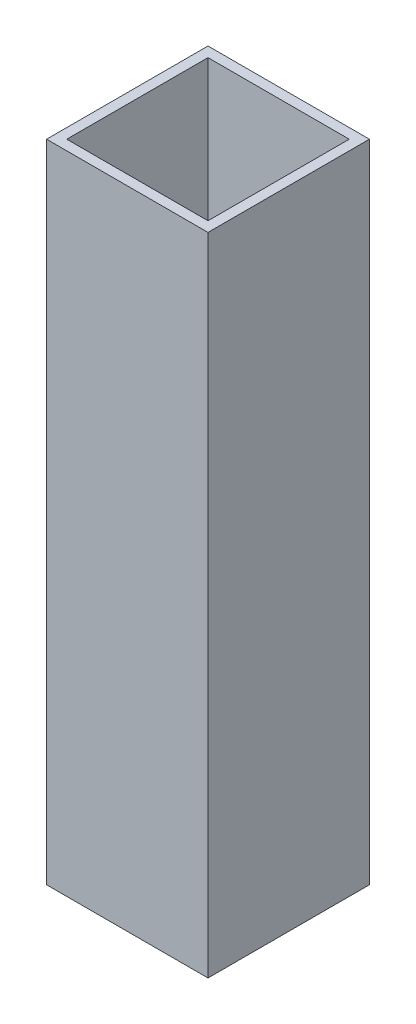
ISO-10303-21;
HEADER;
FILE_DESCRIPTION(('STEP AP214'),'2;1');
FILE_NAME('part.step','',(''),(''),'','','');
FILE_SCHEMA(('AUTOMOTIVE_DESIGN { 1 0 10303 214 1 1 1 1 }'));
ENDSEC;
DATA;
#1=APPLICATION_CONTEXT('core data for automotive mechanical design processes');
#2=APPLICATION_PROTOCOL_DEFINITION('international standard','automotive_design',2000,#1);
#3=PRODUCT_CONTEXT('',#1,'mechanical');
#4=PRODUCT('Part','Part','',(#3));
#5=PRODUCT_RELATED_PRODUCT_CATEGORY('part','',(#4));
#6=PRODUCT_DEFINITION_FORMATION('','',#4);
#7=PRODUCT_DEFINITION_CONTEXT('part definition',#1,'design');
#8=PRODUCT_DEFINITION('design','',#6,#7);
#9=PRODUCT_DEFINITION_SHAPE('','',#8);
#10=(LENGTH_UNIT() NAMED_UNIT(*) SI_UNIT(.MILLI.,.METRE.));
#11=(NAMED_UNIT(*) PLANE_ANGLE_UNIT() SI_UNIT($,.RADIAN.));
#12=(NAMED_UNIT(*) SI_UNIT($,.STERADIAN.) SOLID_ANGLE_UNIT());
#13=UNCERTAINTY_MEASURE_WITH_UNIT(LENGTH_MEASURE(1.E-05),#10,'distance_accuracy_value','');
#14=(GEOMETRIC_REPRESENTATION_CONTEXT(3) GLOBAL_UNCERTAINTY_ASSIGNED_CONTEXT((#13)) GLOBAL_UNIT_ASSIGNED_CONTEXT((#10,
#11,#12)) REPRESENTATION_CONTEXT('',''));
#15=CARTESIAN_POINT('',(0.,0.,0.));
#16=DIRECTION('',(0.,0.,1.));
#17=DIRECTION('',(1.,0.,0.));
#18=AXIS2_PLACEMENT_3D('',#15,#16,#17);
#19=CARTESIAN_POINT('',(0.,101.6,0.));
#20=DIRECTION('',(0.,-1.,0.));
#21=DIRECTION('',(0.,0.,-1.));
#22=AXIS2_PLACEMENT_3D('',#19,#20,#21);
#23=PLANE('',#22);
#24=DIRECTION('',(0.,0.,-1.));
#25=VECTOR('',#24,1.);
#26=CARTESIAN_POINT('',(12.7,101.6,12.7));
#27=LINE('',#26,#25);
#28=CARTESIAN_POINT('',(12.7,101.6,12.7));
#29=VERTEX_POINT('',#28);
#30=CARTESIAN_POINT('',(12.7,101.6,-12.7));
#31=VERTEX_POINT('',#30);
#32=EDGE_CURVE('E136',#29,#31,#27,.T.);
#33=ORIENTED_EDGE('',*,*,#32,.T.);
#34=DIRECTION('',(-1.,0.,0.));
#35=VECTOR('',#34,1.);
#36=CARTESIAN_POINT('',(-12.7,101.6,-12.7));
#37=LINE('',#36,#35);
#38=CARTESIAN_POINT('',(-12.7,101.6,-12.7));
#39=VERTEX_POINT('',#38);
#40=EDGE_CURVE('E139',#31,#39,#37,.T.);
#41=ORIENTED_EDGE('',*,*,#40,.T.);
#42=DIRECTION('',(0.,0.,1.));
#43=VECTOR('',#42,1.);
#44=CARTESIAN_POINT('',(-12.7,101.6,12.7));
#45=LINE('',#44,#43);
#46=CARTESIAN_POINT('',(-12.7,101.6,12.7));
#47=VERTEX_POINT('',#46);
#48=EDGE_CURVE('E142',#39,#47,#45,.T.);
#49=ORIENTED_EDGE('',*,*,#48,.T.);
#50=DIRECTION('',(1.,0.,0.));
#51=VECTOR('',#50,1.);
#52=CARTESIAN_POINT('',(-12.7,101.6,12.7));
#53=LINE('',#52,#51);
#54=EDGE_CURVE('E144',#47,#29,#53,.T.);
#55=ORIENTED_EDGE('',*,*,#54,.T.);
#56=EDGE_LOOP('',(#33,#41,#49,#55));
#57=FACE_BOUND('',#56,.T.);
#58=DIRECTION('',(0.,0.,-1.));
#59=VECTOR('',#58,1.);
#60=CARTESIAN_POINT('',(11.1125,101.6,11.1125));
#61=LINE('',#60,#59);
#62=CARTESIAN_POINT('',(11.1125,101.6,11.1125));
#63=VERTEX_POINT('',#62);
#64=CARTESIAN_POINT('',(11.1125,101.6,-11.1125));
#65=VERTEX_POINT('',#64);
#66=EDGE_CURVE('E100',#63,#65,#61,.T.);
#67=ORIENTED_EDGE('',*,*,#66,.F.);
#68=DIRECTION('',(1.,0.,0.));
#69=VECTOR('',#68,1.);
#70=CARTESIAN_POINT('',(-11.1125,101.6,11.1125));
#71=LINE('',#70,#69);
#72=CARTESIAN_POINT('',(-11.1125,101.6,11.1125));
#73=VERTEX_POINT('',#72);
#74=EDGE_CURVE('E122',#73,#63,#71,.T.);
#75=ORIENTED_EDGE('',*,*,#74,.F.);
#76=DIRECTION('',(0.,0.,1.));
#77=VECTOR('',#76,1.);
#78=CARTESIAN_POINT('',(-11.1125,101.6,11.1125));
#79=LINE('',#78,#77);
#80=CARTESIAN_POINT('',(-11.1125,101.6,-11.1125));
#81=VERTEX_POINT('',#80);
#82=EDGE_CURVE('E120',#81,#73,#79,.T.);
#83=ORIENTED_EDGE('',*,*,#82,.F.);
#84=DIRECTION('',(-1.,0.,0.));
#85=VECTOR('',#84,1.);
#86=CARTESIAN_POINT('',(-11.1125,101.6,-11.1125));
#87=LINE('',#86,#85);
#88=EDGE_CURVE('E108',#65,#81,#87,.T.);
#89=ORIENTED_EDGE('',*,*,#88,.F.);
#90=EDGE_LOOP('',(#67,#75,#83,#89));
#91=FACE_BOUND('',#90,.T.);
#92=ADVANCED_FACE('F35',(#57,#91),#23,.F.);
#93=CARTESIAN_POINT('',(0.,0.,0.));
#94=DIRECTION('',(0.,-1.,0.));
#95=DIRECTION('',(0.,0.,-1.));
#96=AXIS2_PLACEMENT_3D('',#93,#94,#95);
#97=PLANE('',#96);
#98=DIRECTION('',(0.,0.,-1.));
#99=VECTOR('',#98,1.);
#100=CARTESIAN_POINT('',(12.7,0.,12.7));
#101=LINE('',#100,#99);
#102=CARTESIAN_POINT('',(12.7,0.,12.7));
#103=VERTEX_POINT('',#102);
#104=CARTESIAN_POINT('',(12.7,0.,-12.7));
#105=VERTEX_POINT('',#104);
#106=EDGE_CURVE('E116',#103,#105,#101,.T.);
#107=ORIENTED_EDGE('',*,*,#106,.F.);
#108=DIRECTION('',(1.,0.,0.));
#109=VECTOR('',#108,1.);
#110=CARTESIAN_POINT('',(-12.7,0.,12.7));
#111=LINE('',#110,#109);
#112=CARTESIAN_POINT('',(-12.7,0.,12.7));
#113=VERTEX_POINT('',#112);
#114=EDGE_CURVE('E140',#113,#103,#111,.T.);
#115=ORIENTED_EDGE('',*,*,#114,.F.);
#116=DIRECTION('',(0.,0.,1.));
#117=VECTOR('',#116,1.);
#118=CARTESIAN_POINT('',(-12.7,0.,12.7));
#119=LINE('',#118,#117);
#120=CARTESIAN_POINT('',(-12.7,0.,-12.7));
#121=VERTEX_POINT('',#120);
#122=EDGE_CURVE('E151',#121,#113,#119,.T.);
#123=ORIENTED_EDGE('',*,*,#122,.F.);
#124=DIRECTION('',(-1.,0.,0.));
#125=VECTOR('',#124,1.);
#126=CARTESIAN_POINT('',(-12.7,0.,-12.7));
#127=LINE('',#126,#125);
#128=EDGE_CURVE('E149',#105,#121,#127,.T.);
#129=ORIENTED_EDGE('',*,*,#128,.F.);
#130=EDGE_LOOP('',(#107,#115,#123,#129));
#131=FACE_BOUND('',#130,.T.);
#132=DIRECTION('',(1.,0.,0.));
#133=VECTOR('',#132,1.);
#134=CARTESIAN_POINT('',(-11.1125,0.,11.1125));
#135=LINE('',#134,#133);
#136=CARTESIAN_POINT('',(-11.1125,0.,11.1125));
#137=VERTEX_POINT('',#136);
#138=CARTESIAN_POINT('',(11.1125,0.,11.1125));
#139=VERTEX_POINT('',#138);
#140=EDGE_CURVE('E109',#137,#139,#135,.T.);
#141=ORIENTED_EDGE('',*,*,#140,.T.);
#142=DIRECTION('',(0.,0.,-1.));
#143=VECTOR('',#142,1.);
#144=CARTESIAN_POINT('',(11.1125,0.,11.1125));
#145=LINE('',#144,#143);
#146=CARTESIAN_POINT('',(11.1125,0.,-11.1125));
#147=VERTEX_POINT('',#146);
#148=EDGE_CURVE('E58',#139,#147,#145,.T.);
#149=ORIENTED_EDGE('',*,*,#148,.T.);
#150=DIRECTION('',(-1.,0.,0.));
#151=VECTOR('',#150,1.);
#152=CARTESIAN_POINT('',(-11.1125,0.,-11.1125));
#153=LINE('',#152,#151);
#154=CARTESIAN_POINT('',(-11.1125,0.,-11.1125));
#155=VERTEX_POINT('',#154);
#156=EDGE_CURVE('E115',#147,#155,#153,.T.);
#157=ORIENTED_EDGE('',*,*,#156,.T.);
#158=DIRECTION('',(0.,0.,1.));
#159=VECTOR('',#158,1.);
#160=CARTESIAN_POINT('',(-11.1125,0.,11.1125));
#161=LINE('',#160,#159);
#162=EDGE_CURVE('E128',#155,#137,#161,.T.);
#163=ORIENTED_EDGE('',*,*,#162,.T.);
#164=EDGE_LOOP('',(#141,#149,#157,#163));
#165=FACE_BOUND('',#164,.T.);
#166=ADVANCED_FACE('F169',(#131,#165),#97,.T.);
#167=CARTESIAN_POINT('',(12.7,101.6,12.7));
#168=DIRECTION('',(-1.,0.,0.));
#169=DIRECTION('',(0.,0.,1.));
#170=AXIS2_PLACEMENT_3D('',#167,#168,#169);
#171=PLANE('',#170);
#172=ORIENTED_EDGE('',*,*,#106,.T.);
#173=DIRECTION('',(0.,-1.,0.));
#174=VECTOR('',#173,1.);
#175=CARTESIAN_POINT('',(12.7,101.6,-12.7));
#176=LINE('',#175,#174);
#177=EDGE_CURVE('E11',#31,#105,#176,.T.);
#178=ORIENTED_EDGE('',*,*,#177,.F.);
#179=ORIENTED_EDGE('',*,*,#32,.F.);
#180=DIRECTION('',(0.,-1.,0.));
#181=VECTOR('',#180,1.);
#182=CARTESIAN_POINT('',(12.7,101.6,12.7));
#183=LINE('',#182,#181);
#184=EDGE_CURVE('E146',#29,#103,#183,.T.);
#185=ORIENTED_EDGE('',*,*,#184,.T.);
#186=EDGE_LOOP('',(#172,#178,#179,#185));
#187=FACE_BOUND('',#186,.T.);
#188=ADVANCED_FACE('F37',(#187),#171,.F.);
#189=CARTESIAN_POINT('',(-12.7,101.6,-12.7));
#190=DIRECTION('',(0.,0.,1.));
#191=DIRECTION('',(1.,0.,0.));
#192=AXIS2_PLACEMENT_3D('',#189,#190,#191);
#193=PLANE('',#192);
#194=ORIENTED_EDGE('',*,*,#128,.T.);
#195=DIRECTION('',(0.,-1.,0.));
#196=VECTOR('',#195,1.);
#197=CARTESIAN_POINT('',(-12.7,101.6,-12.7));
#198=LINE('',#197,#196);
#199=EDGE_CURVE('E43',#39,#121,#198,.T.);
#200=ORIENTED_EDGE('',*,*,#199,.F.);
#201=ORIENTED_EDGE('',*,*,#40,.F.);
#202=ORIENTED_EDGE('',*,*,#177,.T.);
#203=EDGE_LOOP('',(#194,#200,#201,#202));
#204=FACE_BOUND('',#203,.T.);
#205=ADVANCED_FACE('F179',(#204),#193,.F.);
#206=CARTESIAN_POINT('',(-12.7,101.6,12.7));
#207=DIRECTION('',(1.,0.,0.));
#208=DIRECTION('',(0.,0.,-1.));
#209=AXIS2_PLACEMENT_3D('',#206,#207,#208);
#210=PLANE('',#209);
#211=ORIENTED_EDGE('',*,*,#122,.T.);
#212=DIRECTION('',(0.,-1.,0.));
#213=VECTOR('',#212,1.);
#214=CARTESIAN_POINT('',(-12.7,101.6,12.7));
#215=LINE('',#214,#213);
#216=EDGE_CURVE('E156',#47,#113,#215,.T.);
#217=ORIENTED_EDGE('',*,*,#216,.F.);
#218=ORIENTED_EDGE('',*,*,#48,.F.);
#219=ORIENTED_EDGE('',*,*,#199,.T.);
#220=EDGE_LOOP('',(#211,#217,#218,#219));
#221=FACE_BOUND('',#220,.T.);
#222=ADVANCED_FACE('F163',(#221),#210,.F.);
#223=CARTESIAN_POINT('',(-12.7,101.6,12.7));
#224=DIRECTION('',(0.,0.,-1.));
#225=DIRECTION('',(-1.,0.,0.));
#226=AXIS2_PLACEMENT_3D('',#223,#224,#225);
#227=PLANE('',#226);
#228=ORIENTED_EDGE('',*,*,#114,.T.);
#229=ORIENTED_EDGE('',*,*,#184,.F.);
#230=ORIENTED_EDGE('',*,*,#54,.F.);
#231=ORIENTED_EDGE('',*,*,#216,.T.);
#232=EDGE_LOOP('',(#228,#229,#230,#231));
#233=FACE_BOUND('',#232,.T.);
#234=ADVANCED_FACE('F173',(#233),#227,.F.);
#235=CARTESIAN_POINT('',(11.1125,101.6,11.1125));
#236=DIRECTION('',(-1.,0.,0.));
#237=DIRECTION('',(0.,0.,1.));
#238=AXIS2_PLACEMENT_3D('',#235,#236,#237);
#239=PLANE('',#238);
#240=ORIENTED_EDGE('',*,*,#148,.F.);
#241=DIRECTION('',(0.,-1.,0.));
#242=VECTOR('',#241,1.);
#243=CARTESIAN_POINT('',(11.1125,101.6,11.1125));
#244=LINE('',#243,#242);
#245=EDGE_CURVE('E104',#63,#139,#244,.T.);
#246=ORIENTED_EDGE('',*,*,#245,.F.);
#247=ORIENTED_EDGE('',*,*,#66,.T.);
#248=DIRECTION('',(0.,-1.,0.));
#249=VECTOR('',#248,1.);
#250=CARTESIAN_POINT('',(11.1125,101.6,-11.1125));
#251=LINE('',#250,#249);
#252=EDGE_CURVE('E103',#65,#147,#251,.T.);
#253=ORIENTED_EDGE('',*,*,#252,.T.);
#254=EDGE_LOOP('',(#240,#246,#247,#253));
#255=FACE_BOUND('',#254,.T.);
#256=ADVANCED_FACE('F102',(#255),#239,.T.);
#257=CARTESIAN_POINT('',(-11.1125,101.6,-11.1125));
#258=DIRECTION('',(0.,0.,1.));
#259=DIRECTION('',(1.,0.,0.));
#260=AXIS2_PLACEMENT_3D('',#257,#258,#259);
#261=PLANE('',#260);
#262=ORIENTED_EDGE('',*,*,#156,.F.);
#263=ORIENTED_EDGE('',*,*,#252,.F.);
#264=ORIENTED_EDGE('',*,*,#88,.T.);
#265=DIRECTION('',(0.,-1.,0.));
#266=VECTOR('',#265,1.);
#267=CARTESIAN_POINT('',(-11.1125,101.6,-11.1125));
#268=LINE('',#267,#266);
#269=EDGE_CURVE('E117',#81,#155,#268,.T.);
#270=ORIENTED_EDGE('',*,*,#269,.T.);
#271=EDGE_LOOP('',(#262,#263,#264,#270));
#272=FACE_BOUND('',#271,.T.);
#273=ADVANCED_FACE('F112',(#272),#261,.T.);
#274=CARTESIAN_POINT('',(-11.1125,101.6,11.1125));
#275=DIRECTION('',(1.,0.,0.));
#276=DIRECTION('',(0.,0.,-1.));
#277=AXIS2_PLACEMENT_3D('',#274,#275,#276);
#278=PLANE('',#277);
#279=ORIENTED_EDGE('',*,*,#162,.F.);
#280=ORIENTED_EDGE('',*,*,#269,.F.);
#281=ORIENTED_EDGE('',*,*,#82,.T.);
#282=DIRECTION('',(0.,-1.,0.));
#283=VECTOR('',#282,1.);
#284=CARTESIAN_POINT('',(-11.1125,101.6,11.1125));
#285=LINE('',#284,#283);
#286=EDGE_CURVE('E50',#73,#137,#285,.T.);
#287=ORIENTED_EDGE('',*,*,#286,.T.);
#288=EDGE_LOOP('',(#279,#280,#281,#287));
#289=FACE_BOUND('',#288,.T.);
#290=ADVANCED_FACE('F202',(#289),#278,.T.);
#291=CARTESIAN_POINT('',(-11.1125,101.6,11.1125));
#292=DIRECTION('',(0.,0.,-1.));
#293=DIRECTION('',(-1.,0.,0.));
#294=AXIS2_PLACEMENT_3D('',#291,#292,#293);
#295=PLANE('',#294);
#296=ORIENTED_EDGE('',*,*,#140,.F.);
#297=ORIENTED_EDGE('',*,*,#286,.F.);
#298=ORIENTED_EDGE('',*,*,#74,.T.);
#299=ORIENTED_EDGE('',*,*,#245,.T.);
#300=EDGE_LOOP('',(#296,#297,#298,#299));
#301=FACE_BOUND('',#300,.T.);
#302=ADVANCED_FACE('F206',(#301),#295,.T.);
#303=CLOSED_SHELL('',(#92,#166,#188,#205,#222,#234,#256,#273,#290,#302));
#304=MANIFOLD_SOLID_BREP('B2',#303);
#305=ADVANCED_BREP_SHAPE_REPRESENTATION('',(#18,#304),#14);
#306=SHAPE_DEFINITION_REPRESENTATION(#9,#305);
ENDSEC;
END-ISO-10303-21;
